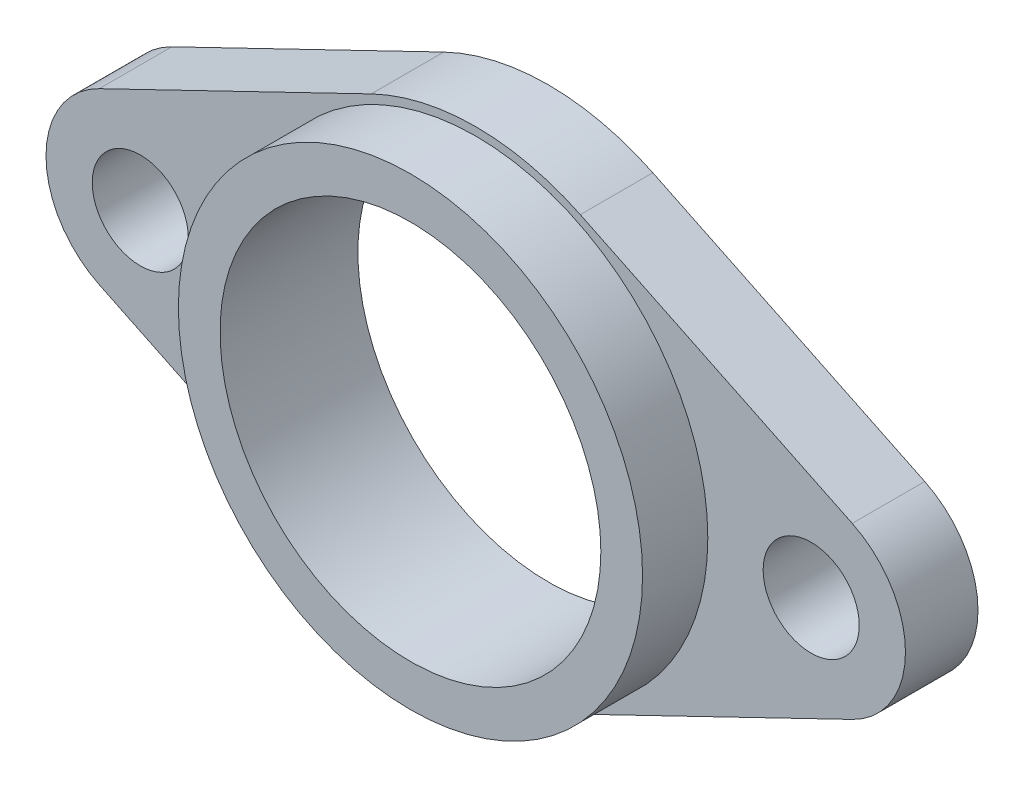
ISO-10303-21;
HEADER;
FILE_DESCRIPTION(('STEP AP214'),'2;1');
FILE_NAME('part.step','',(''),(''),'','','');
FILE_SCHEMA(('AUTOMOTIVE_DESIGN { 1 0 10303 214 1 1 1 1 }'));
ENDSEC;
DATA;
#1=APPLICATION_CONTEXT('core data for automotive mechanical design processes');
#2=APPLICATION_PROTOCOL_DEFINITION('international standard','automotive_design',2000,#1);
#3=PRODUCT_CONTEXT('',#1,'mechanical');
#4=PRODUCT('Part','Part','',(#3));
#5=PRODUCT_RELATED_PRODUCT_CATEGORY('part','',(#4));
#6=PRODUCT_DEFINITION_FORMATION('','',#4);
#7=PRODUCT_DEFINITION_CONTEXT('part definition',#1,'design');
#8=PRODUCT_DEFINITION('design','',#6,#7);
#9=PRODUCT_DEFINITION_SHAPE('','',#8);
#10=(LENGTH_UNIT() NAMED_UNIT(*) SI_UNIT(.MILLI.,.METRE.));
#11=(NAMED_UNIT(*) PLANE_ANGLE_UNIT() SI_UNIT($,.RADIAN.));
#12=(NAMED_UNIT(*) SI_UNIT($,.STERADIAN.) SOLID_ANGLE_UNIT());
#13=UNCERTAINTY_MEASURE_WITH_UNIT(LENGTH_MEASURE(1.E-05),#10,'distance_accuracy_value','');
#14=(GEOMETRIC_REPRESENTATION_CONTEXT(3) GLOBAL_UNCERTAINTY_ASSIGNED_CONTEXT((#13)) GLOBAL_UNIT_ASSIGNED_CONTEXT((#10,
#11,#12)) REPRESENTATION_CONTEXT('',''));
#15=CARTESIAN_POINT('',(0.,0.,0.));
#16=DIRECTION('',(0.,0.,1.));
#17=DIRECTION('',(1.,0.,0.));
#18=AXIS2_PLACEMENT_3D('',#15,#16,#17);
#19=CARTESIAN_POINT('',(-18.5,0.,0.));
#20=DIRECTION('',(0.,0.,1.));
#21=DIRECTION('',(1.,0.,0.));
#22=AXIS2_PLACEMENT_3D('',#19,#20,#21);
#23=PLANE('',#22);
#24=CARTESIAN_POINT('',(0.,0.,0.));
#25=DIRECTION('',(0.,0.,1.));
#26=DIRECTION('',(1.,0.,0.));
#27=AXIS2_PLACEMENT_3D('',#24,#25,#26);
#28=CIRCLE('',#27,10.5);
#29=CARTESIAN_POINT('',(10.5,0.,0.));
#30=VERTEX_POINT('',#29);
#31=EDGE_CURVE('E136',#30,#30,#28,.T.);
#32=ORIENTED_EDGE('',*,*,#31,.T.);
#33=EDGE_LOOP('',(#32));
#34=FACE_BOUND('',#33,.T.);
#35=CARTESIAN_POINT('',(-18.5,0.,0.));
#36=DIRECTION('',(0.,0.,1.));
#37=DIRECTION('',(1.,0.,0.));
#38=AXIS2_PLACEMENT_3D('',#35,#36,#37);
#39=CIRCLE('',#38,5.2);
#40=CARTESIAN_POINT('',(-20.7627027027027,4.68189881129248,0.));
#41=VERTEX_POINT('',#40);
#42=CARTESIAN_POINT('',(-20.7627027027027,-4.68189881129247,0.));
#43=VERTEX_POINT('',#42);
#44=EDGE_CURVE('E132',#41,#43,#39,.T.);
#45=ORIENTED_EDGE('',*,*,#44,.F.);
#46=DIRECTION('',(-0.900365156017784,-0.435135135135135,0.));
#47=VECTOR('',#46,1.);
#48=CARTESIAN_POINT('',(-20.7627027027027,4.68189881129248,0.));
#49=LINE('',#48,#47);
#50=CARTESIAN_POINT('',(-5.76554054054054,11.9298383172356,0.));
#51=VERTEX_POINT('',#50);
#52=EDGE_CURVE('E86',#51,#41,#49,.T.);
#53=ORIENTED_EDGE('',*,*,#52,.F.);
#54=CARTESIAN_POINT('',(0.,0.,0.));
#55=DIRECTION('',(0.,0.,1.));
#56=DIRECTION('',(1.,0.,0.));
#57=AXIS2_PLACEMENT_3D('',#54,#55,#56);
#58=CIRCLE('',#57,13.25);
#59=CARTESIAN_POINT('',(5.76554054054054,11.9298383172356,0.));
#60=VERTEX_POINT('',#59);
#61=EDGE_CURVE('E80',#60,#51,#58,.T.);
#62=ORIENTED_EDGE('',*,*,#61,.F.);
#63=DIRECTION('',(-0.900365156017784,0.435135135135135,0.));
#64=VECTOR('',#63,1.);
#65=CARTESIAN_POINT('',(5.76554054054054,11.9298383172356,0.));
#66=LINE('',#65,#64);
#67=CARTESIAN_POINT('',(20.7627027027027,4.68189881129248,0.));
#68=VERTEX_POINT('',#67);
#69=EDGE_CURVE('E122',#68,#60,#66,.T.);
#70=ORIENTED_EDGE('',*,*,#69,.F.);
#71=CARTESIAN_POINT('',(18.5,0.,0.));
#72=DIRECTION('',(0.,0.,1.));
#73=DIRECTION('',(1.,0.,0.));
#74=AXIS2_PLACEMENT_3D('',#71,#72,#73);
#75=CIRCLE('',#74,5.2);
#76=CARTESIAN_POINT('',(20.7627027027027,-4.68189881129248,0.));
#77=VERTEX_POINT('',#76);
#78=EDGE_CURVE('E142',#77,#68,#75,.T.);
#79=ORIENTED_EDGE('',*,*,#78,.F.);
#80=DIRECTION('',(0.900365156017784,0.435135135135135,0.));
#81=VECTOR('',#80,1.);
#82=CARTESIAN_POINT('',(20.7627027027027,-4.68189881129248,0.));
#83=LINE('',#82,#81);
#84=CARTESIAN_POINT('',(5.76554054054054,-11.9298383172356,0.));
#85=VERTEX_POINT('',#84);
#86=EDGE_CURVE('E140',#85,#77,#83,.T.);
#87=ORIENTED_EDGE('',*,*,#86,.F.);
#88=CARTESIAN_POINT('',(0.,0.,0.));
#89=DIRECTION('',(0.,0.,1.));
#90=DIRECTION('',(1.,0.,0.));
#91=AXIS2_PLACEMENT_3D('',#88,#89,#90);
#92=CIRCLE('',#91,13.25);
#93=CARTESIAN_POINT('',(-5.76554054054054,-11.9298383172356,0.));
#94=VERTEX_POINT('',#93);
#95=EDGE_CURVE('E138',#94,#85,#92,.T.);
#96=ORIENTED_EDGE('',*,*,#95,.F.);
#97=DIRECTION('',(0.900365156017784,-0.435135135135135,0.));
#98=VECTOR('',#97,1.);
#99=CARTESIAN_POINT('',(-20.7627027027027,-4.68189881129247,0.));
#100=LINE('',#99,#98);
#101=EDGE_CURVE('E135',#43,#94,#100,.T.);
#102=ORIENTED_EDGE('',*,*,#101,.F.);
#103=EDGE_LOOP('',(#45,#53,#62,#70,#79,#87,#96,#102));
#104=FACE_BOUND('',#103,.T.);
#105=CARTESIAN_POINT('',(18.5,0.,0.));
#106=DIRECTION('',(0.,0.,-1.));
#107=DIRECTION('',(-1.,0.,0.));
#108=AXIS2_PLACEMENT_3D('',#105,#106,#107);
#109=CIRCLE('',#108,2.65);
#110=CARTESIAN_POINT('',(15.85,0.,0.));
#111=VERTEX_POINT('',#110);
#112=EDGE_CURVE('E194',#111,#111,#109,.T.);
#113=ORIENTED_EDGE('',*,*,#112,.F.);
#114=EDGE_LOOP('',(#113));
#115=FACE_BOUND('',#114,.T.);
#116=CARTESIAN_POINT('',(-18.5,0.,0.));
#117=DIRECTION('',(0.,0.,-1.));
#118=DIRECTION('',(-1.,0.,0.));
#119=AXIS2_PLACEMENT_3D('',#116,#117,#118);
#120=CIRCLE('',#119,2.65);
#121=CARTESIAN_POINT('',(-21.15,0.,0.));
#122=VERTEX_POINT('',#121);
#123=EDGE_CURVE('E200',#122,#122,#120,.T.);
#124=ORIENTED_EDGE('',*,*,#123,.F.);
#125=EDGE_LOOP('',(#124));
#126=FACE_BOUND('',#125,.T.);
#127=ADVANCED_FACE('F34',(#34,#104,#115,#126),#23,.F.);
#128=CARTESIAN_POINT('',(-18.5,0.,4.));
#129=DIRECTION('',(0.,0.,1.));
#130=DIRECTION('',(1.,0.,0.));
#131=AXIS2_PLACEMENT_3D('',#128,#129,#130);
#132=PLANE('',#131);
#133=CARTESIAN_POINT('',(-18.5,0.,4.));
#134=DIRECTION('',(0.,0.,1.));
#135=DIRECTION('',(1.,0.,0.));
#136=AXIS2_PLACEMENT_3D('',#133,#134,#135);
#137=CIRCLE('',#136,2.65);
#138=CARTESIAN_POINT('',(-15.85,0.,4.));
#139=VERTEX_POINT('',#138);
#140=EDGE_CURVE('E197',#139,#139,#137,.T.);
#141=ORIENTED_EDGE('',*,*,#140,.F.);
#142=EDGE_LOOP('',(#141));
#143=FACE_BOUND('',#142,.T.);
#144=CARTESIAN_POINT('',(18.5,0.,4.));
#145=DIRECTION('',(0.,0.,1.));
#146=DIRECTION('',(1.,0.,0.));
#147=AXIS2_PLACEMENT_3D('',#144,#145,#146);
#148=CIRCLE('',#147,2.65);
#149=CARTESIAN_POINT('',(21.15,0.,4.));
#150=VERTEX_POINT('',#149);
#151=EDGE_CURVE('E191',#150,#150,#148,.T.);
#152=ORIENTED_EDGE('',*,*,#151,.F.);
#153=EDGE_LOOP('',(#152));
#154=FACE_BOUND('',#153,.T.);
#155=CARTESIAN_POINT('',(-18.5,0.,4.));
#156=DIRECTION('',(0.,0.,1.));
#157=DIRECTION('',(1.,0.,0.));
#158=AXIS2_PLACEMENT_3D('',#155,#156,#157);
#159=CIRCLE('',#158,5.2);
#160=CARTESIAN_POINT('',(-20.7627027027027,4.68189881129248,4.));
#161=VERTEX_POINT('',#160);
#162=CARTESIAN_POINT('',(-20.7627027027027,-4.68189881129247,4.));
#163=VERTEX_POINT('',#162);
#164=EDGE_CURVE('E147',#161,#163,#159,.T.);
#165=ORIENTED_EDGE('',*,*,#164,.T.);
#166=DIRECTION('',(0.900365156017784,-0.435135135135135,0.));
#167=VECTOR('',#166,1.);
#168=CARTESIAN_POINT('',(-20.7627027027027,-4.68189881129247,4.));
#169=LINE('',#168,#167);
#170=CARTESIAN_POINT('',(-5.76554054054054,-11.9298383172356,4.));
#171=VERTEX_POINT('',#170);
#172=EDGE_CURVE('E94',#163,#171,#169,.T.);
#173=ORIENTED_EDGE('',*,*,#172,.T.);
#174=CARTESIAN_POINT('',(0.,0.,4.));
#175=DIRECTION('',(0.,0.,1.));
#176=DIRECTION('',(1.,0.,0.));
#177=AXIS2_PLACEMENT_3D('',#174,#175,#176);
#178=CIRCLE('',#177,13.25);
#179=CARTESIAN_POINT('',(5.76554054054054,-11.9298383172356,4.));
#180=VERTEX_POINT('',#179);
#181=EDGE_CURVE('E162',#171,#180,#178,.T.);
#182=ORIENTED_EDGE('',*,*,#181,.T.);
#183=DIRECTION('',(0.900365156017784,0.435135135135135,0.));
#184=VECTOR('',#183,1.);
#185=CARTESIAN_POINT('',(20.7627027027027,-4.68189881129248,4.));
#186=LINE('',#185,#184);
#187=CARTESIAN_POINT('',(20.7627027027027,-4.68189881129248,4.));
#188=VERTEX_POINT('',#187);
#189=EDGE_CURVE('E174',#180,#188,#186,.T.);
#190=ORIENTED_EDGE('',*,*,#189,.T.);
#191=CARTESIAN_POINT('',(18.5,0.,4.));
#192=DIRECTION('',(0.,0.,1.));
#193=DIRECTION('',(1.,0.,0.));
#194=AXIS2_PLACEMENT_3D('',#191,#192,#193);
#195=CIRCLE('',#194,5.2);
#196=CARTESIAN_POINT('',(20.7627027027027,4.68189881129248,4.));
#197=VERTEX_POINT('',#196);
#198=EDGE_CURVE('E114',#188,#197,#195,.T.);
#199=ORIENTED_EDGE('',*,*,#198,.T.);
#200=DIRECTION('',(-0.900365156017784,0.435135135135135,0.));
#201=VECTOR('',#200,1.);
#202=CARTESIAN_POINT('',(5.76554054054054,11.9298383172356,4.));
#203=LINE('',#202,#201);
#204=CARTESIAN_POINT('',(5.76554054054054,11.9298383172356,4.));
#205=VERTEX_POINT('',#204);
#206=EDGE_CURVE('E107',#197,#205,#203,.T.);
#207=ORIENTED_EDGE('',*,*,#206,.T.);
#208=CARTESIAN_POINT('',(0.,0.,4.));
#209=DIRECTION('',(0.,0.,1.));
#210=DIRECTION('',(1.,0.,0.));
#211=AXIS2_PLACEMENT_3D('',#208,#209,#210);
#212=CIRCLE('',#211,13.25);
#213=CARTESIAN_POINT('',(-5.76554054054054,11.9298383172356,4.));
#214=VERTEX_POINT('',#213);
#215=EDGE_CURVE('E112',#205,#214,#212,.T.);
#216=ORIENTED_EDGE('',*,*,#215,.T.);
#217=DIRECTION('',(-0.900365156017784,-0.435135135135135,0.));
#218=VECTOR('',#217,1.);
#219=CARTESIAN_POINT('',(-20.7627027027027,4.68189881129248,4.));
#220=LINE('',#219,#218);
#221=EDGE_CURVE('E51',#214,#161,#220,.T.);
#222=ORIENTED_EDGE('',*,*,#221,.T.);
#223=EDGE_LOOP('',(#165,#173,#182,#190,#199,#207,#216,#222));
#224=FACE_BOUND('',#223,.T.);
#225=CARTESIAN_POINT('',(0.,0.,4.));
#226=DIRECTION('',(0.,0.,1.));
#227=DIRECTION('',(1.,0.,0.));
#228=AXIS2_PLACEMENT_3D('',#225,#226,#227);
#229=CIRCLE('',#228,12.8);
#230=CARTESIAN_POINT('',(-12.8,0.,4.));
#231=VERTEX_POINT('',#230);
#232=EDGE_CURVE('E182',#231,#231,#229,.F.);
#233=ORIENTED_EDGE('',*,*,#232,.T.);
#234=EDGE_LOOP('',(#233));
#235=FACE_BOUND('',#234,.T.);
#236=ADVANCED_FACE('F109',(#143,#154,#224,#235),#132,.T.);
#237=CARTESIAN_POINT('',(-18.5,0.,4.));
#238=DIRECTION('',(0.,0.,-1.));
#239=DIRECTION('',(-1.,0.,0.));
#240=AXIS2_PLACEMENT_3D('',#237,#238,#239);
#241=CYLINDRICAL_SURFACE('',#240,5.2);
#242=ORIENTED_EDGE('',*,*,#44,.T.);
#243=DIRECTION('',(0.,0.,-1.));
#244=VECTOR('',#243,1.);
#245=CARTESIAN_POINT('',(-20.7627027027027,-4.68189881129247,4.));
#246=LINE('',#245,#244);
#247=EDGE_CURVE('E11',#163,#43,#246,.T.);
#248=ORIENTED_EDGE('',*,*,#247,.F.);
#249=ORIENTED_EDGE('',*,*,#164,.F.);
#250=DIRECTION('',(0.,0.,-1.));
#251=VECTOR('',#250,1.);
#252=CARTESIAN_POINT('',(-20.7627027027027,4.68189881129248,4.));
#253=LINE('',#252,#251);
#254=EDGE_CURVE('E128',#161,#41,#253,.T.);
#255=ORIENTED_EDGE('',*,*,#254,.T.);
#256=EDGE_LOOP('',(#242,#248,#249,#255));
#257=FACE_BOUND('',#256,.T.);
#258=ADVANCED_FACE('F36',(#257),#241,.T.);
#259=CARTESIAN_POINT('',(-20.7627027027027,-4.68189881129247,4.));
#260=DIRECTION('',(0.435135135135135,0.900365156017784,0.));
#261=DIRECTION('',(-0.900365156017784,0.435135135135135,0.));
#262=AXIS2_PLACEMENT_3D('',#259,#260,#261);
#263=PLANE('',#262);
#264=ORIENTED_EDGE('',*,*,#101,.T.);
#265=DIRECTION('',(0.,0.,-1.));
#266=VECTOR('',#265,1.);
#267=CARTESIAN_POINT('',(-5.76554054054054,-11.9298383172356,4.));
#268=LINE('',#267,#266);
#269=EDGE_CURVE('E43',#171,#94,#268,.T.);
#270=ORIENTED_EDGE('',*,*,#269,.F.);
#271=ORIENTED_EDGE('',*,*,#172,.F.);
#272=ORIENTED_EDGE('',*,*,#247,.T.);
#273=EDGE_LOOP('',(#264,#270,#271,#272));
#274=FACE_BOUND('',#273,.T.);
#275=ADVANCED_FACE('F230',(#274),#263,.F.);
#276=CARTESIAN_POINT('',(0.,0.,4.));
#277=DIRECTION('',(0.,0.,-1.));
#278=DIRECTION('',(-1.,0.,0.));
#279=AXIS2_PLACEMENT_3D('',#276,#277,#278);
#280=CYLINDRICAL_SURFACE('',#279,13.25);
#281=ORIENTED_EDGE('',*,*,#95,.T.);
#282=DIRECTION('',(0.,0.,-1.));
#283=VECTOR('',#282,1.);
#284=CARTESIAN_POINT('',(5.76554054054054,-11.9298383172356,4.));
#285=LINE('',#284,#283);
#286=EDGE_CURVE('E154',#180,#85,#285,.T.);
#287=ORIENTED_EDGE('',*,*,#286,.F.);
#288=ORIENTED_EDGE('',*,*,#181,.F.);
#289=ORIENTED_EDGE('',*,*,#269,.T.);
#290=EDGE_LOOP('',(#281,#287,#288,#289));
#291=FACE_BOUND('',#290,.T.);
#292=ADVANCED_FACE('F160',(#291),#280,.T.);
#293=CARTESIAN_POINT('',(20.7627027027027,-4.68189881129248,4.));
#294=DIRECTION('',(-0.435135135135135,0.900365156017784,0.));
#295=DIRECTION('',(-0.900365156017784,-0.435135135135135,0.));
#296=AXIS2_PLACEMENT_3D('',#293,#294,#295);
#297=PLANE('',#296);
#298=ORIENTED_EDGE('',*,*,#86,.T.);
#299=DIRECTION('',(0.,0.,-1.));
#300=VECTOR('',#299,1.);
#301=CARTESIAN_POINT('',(20.7627027027027,-4.68189881129248,4.));
#302=LINE('',#301,#300);
#303=EDGE_CURVE('E151',#188,#77,#302,.T.);
#304=ORIENTED_EDGE('',*,*,#303,.F.);
#305=ORIENTED_EDGE('',*,*,#189,.F.);
#306=ORIENTED_EDGE('',*,*,#286,.T.);
#307=EDGE_LOOP('',(#298,#304,#305,#306));
#308=FACE_BOUND('',#307,.T.);
#309=ADVANCED_FACE('F170',(#308),#297,.F.);
#310=CARTESIAN_POINT('',(18.5,0.,4.));
#311=DIRECTION('',(0.,0.,-1.));
#312=DIRECTION('',(-1.,0.,0.));
#313=AXIS2_PLACEMENT_3D('',#310,#311,#312);
#314=CYLINDRICAL_SURFACE('',#313,5.2);
#315=ORIENTED_EDGE('',*,*,#78,.T.);
#316=DIRECTION('',(0.,0.,-1.));
#317=VECTOR('',#316,1.);
#318=CARTESIAN_POINT('',(20.7627027027027,4.68189881129248,4.));
#319=LINE('',#318,#317);
#320=EDGE_CURVE('E123',#197,#68,#319,.T.);
#321=ORIENTED_EDGE('',*,*,#320,.F.);
#322=ORIENTED_EDGE('',*,*,#198,.F.);
#323=ORIENTED_EDGE('',*,*,#303,.T.);
#324=EDGE_LOOP('',(#315,#321,#322,#323));
#325=FACE_BOUND('',#324,.T.);
#326=ADVANCED_FACE('F173',(#325),#314,.T.);
#327=CARTESIAN_POINT('',(5.76554054054054,11.9298383172356,4.));
#328=DIRECTION('',(-0.435135135135135,-0.900365156017784,0.));
#329=DIRECTION('',(0.900365156017784,-0.435135135135135,0.));
#330=AXIS2_PLACEMENT_3D('',#327,#328,#329);
#331=PLANE('',#330);
#332=ORIENTED_EDGE('',*,*,#69,.T.);
#333=DIRECTION('',(0.,0.,-1.));
#334=VECTOR('',#333,1.);
#335=CARTESIAN_POINT('',(5.76554054054054,11.9298383172356,4.));
#336=LINE('',#335,#334);
#337=EDGE_CURVE('E119',#205,#60,#336,.T.);
#338=ORIENTED_EDGE('',*,*,#337,.F.);
#339=ORIENTED_EDGE('',*,*,#206,.F.);
#340=ORIENTED_EDGE('',*,*,#320,.T.);
#341=EDGE_LOOP('',(#332,#338,#339,#340));
#342=FACE_BOUND('',#341,.T.);
#343=ADVANCED_FACE('F120',(#342),#331,.F.);
#344=CARTESIAN_POINT('',(0.,0.,4.));
#345=DIRECTION('',(0.,0.,-1.));
#346=DIRECTION('',(-1.,0.,0.));
#347=AXIS2_PLACEMENT_3D('',#344,#345,#346);
#348=CYLINDRICAL_SURFACE('',#347,13.25);
#349=ORIENTED_EDGE('',*,*,#61,.T.);
#350=DIRECTION('',(0.,0.,-1.));
#351=VECTOR('',#350,1.);
#352=CARTESIAN_POINT('',(-5.76554054054054,11.9298383172356,4.));
#353=LINE('',#352,#351);
#354=EDGE_CURVE('E124',#214,#51,#353,.T.);
#355=ORIENTED_EDGE('',*,*,#354,.F.);
#356=ORIENTED_EDGE('',*,*,#215,.F.);
#357=ORIENTED_EDGE('',*,*,#337,.T.);
#358=EDGE_LOOP('',(#349,#355,#356,#357));
#359=FACE_BOUND('',#358,.T.);
#360=ADVANCED_FACE('F126',(#359),#348,.T.);
#361=CARTESIAN_POINT('',(-20.7627027027027,4.68189881129248,4.));
#362=DIRECTION('',(0.435135135135135,-0.900365156017784,0.));
#363=DIRECTION('',(0.900365156017784,0.435135135135135,0.));
#364=AXIS2_PLACEMENT_3D('',#361,#362,#363);
#365=PLANE('',#364);
#366=ORIENTED_EDGE('',*,*,#52,.T.);
#367=ORIENTED_EDGE('',*,*,#254,.F.);
#368=ORIENTED_EDGE('',*,*,#221,.F.);
#369=ORIENTED_EDGE('',*,*,#354,.T.);
#370=EDGE_LOOP('',(#366,#367,#368,#369));
#371=FACE_BOUND('',#370,.T.);
#372=ADVANCED_FACE('F217',(#371),#365,.F.);
#373=CARTESIAN_POINT('',(0.,0.,4.));
#374=DIRECTION('',(0.,0.,-1.));
#375=DIRECTION('',(-1.,0.,0.));
#376=AXIS2_PLACEMENT_3D('',#373,#374,#375);
#377=CYLINDRICAL_SURFACE('',#376,10.5);
#378=ORIENTED_EDGE('',*,*,#31,.F.);
#379=EDGE_LOOP('',(#378));
#380=FACE_BOUND('',#379,.T.);
#381=CARTESIAN_POINT('',(0.,0.,7.6));
#382=DIRECTION('',(0.,0.,1.));
#383=DIRECTION('',(1.,0.,0.));
#384=AXIS2_PLACEMENT_3D('',#381,#382,#383);
#385=CIRCLE('',#384,10.5);
#386=CARTESIAN_POINT('',(10.5,0.,7.6));
#387=VERTEX_POINT('',#386);
#388=EDGE_CURVE('E188',#387,#387,#385,.T.);
#389=ORIENTED_EDGE('',*,*,#388,.T.);
#390=EDGE_LOOP('',(#389));
#391=FACE_BOUND('',#390,.T.);
#392=ADVANCED_FACE('F220',(#380,#391),#377,.F.);
#393=CARTESIAN_POINT('',(0.,0.,7.6));
#394=DIRECTION('',(0.,0.,1.));
#395=DIRECTION('',(1.,0.,0.));
#396=AXIS2_PLACEMENT_3D('',#393,#394,#395);
#397=PLANE('',#396);
#398=CARTESIAN_POINT('',(0.,0.,7.6));
#399=DIRECTION('',(0.,0.,1.));
#400=DIRECTION('',(1.,0.,0.));
#401=AXIS2_PLACEMENT_3D('',#398,#399,#400);
#402=CIRCLE('',#401,12.8);
#403=CARTESIAN_POINT('',(-12.8,0.,7.6));
#404=VERTEX_POINT('',#403);
#405=EDGE_CURVE('E185',#404,#404,#402,.T.);
#406=ORIENTED_EDGE('',*,*,#405,.T.);
#407=EDGE_LOOP('',(#406));
#408=FACE_BOUND('',#407,.T.);
#409=ORIENTED_EDGE('',*,*,#388,.F.);
#410=EDGE_LOOP('',(#409));
#411=FACE_BOUND('',#410,.T.);
#412=ADVANCED_FACE('F274',(#408,#411),#397,.T.);
#413=CARTESIAN_POINT('',(0.,0.,7.6));
#414=DIRECTION('',(0.,0.,-1.));
#415=DIRECTION('',(-1.,0.,0.));
#416=AXIS2_PLACEMENT_3D('',#413,#414,#415);
#417=CYLINDRICAL_SURFACE('',#416,12.8);
#418=CARTESIAN_POINT('',(-12.8,0.,4.));
#419=CARTESIAN_POINT('',(-12.8,0.,4.0375));
#420=CARTESIAN_POINT('',(-12.8,0.,4.075));
#421=CARTESIAN_POINT('',(-12.8,0.,4.15));
#422=CARTESIAN_POINT('',(-12.8,0.,4.1875));
#423=CARTESIAN_POINT('',(-12.8,0.,4.2625));
#424=CARTESIAN_POINT('',(-12.8,0.,4.3));
#425=CARTESIAN_POINT('',(-12.8,0.,4.375));
#426=CARTESIAN_POINT('',(-12.8,0.,4.4125));
#427=CARTESIAN_POINT('',(-12.8,0.,4.4875));
#428=CARTESIAN_POINT('',(-12.8,0.,4.525));
#429=CARTESIAN_POINT('',(-12.8,0.,4.6));
#430=CARTESIAN_POINT('',(-12.8,0.,4.6375));
#431=CARTESIAN_POINT('',(-12.8,0.,4.7125));
#432=CARTESIAN_POINT('',(-12.8,0.,4.75));
#433=CARTESIAN_POINT('',(-12.8,0.,4.825));
#434=CARTESIAN_POINT('',(-12.8,0.,4.8625));
#435=CARTESIAN_POINT('',(-12.8,0.,4.9375));
#436=CARTESIAN_POINT('',(-12.8,0.,4.975));
#437=CARTESIAN_POINT('',(-12.8,0.,5.05));
#438=CARTESIAN_POINT('',(-12.8,0.,5.0875));
#439=CARTESIAN_POINT('',(-12.8,0.,5.1625));
#440=CARTESIAN_POINT('',(-12.8,0.,5.2));
#441=CARTESIAN_POINT('',(-12.8,0.,5.275));
#442=CARTESIAN_POINT('',(-12.8,0.,5.3125));
#443=CARTESIAN_POINT('',(-12.8,0.,5.3875));
#444=CARTESIAN_POINT('',(-12.8,0.,5.425));
#445=CARTESIAN_POINT('',(-12.8,0.,5.5));
#446=CARTESIAN_POINT('',(-12.8,0.,5.5375));
#447=CARTESIAN_POINT('',(-12.8,0.,5.6125));
#448=CARTESIAN_POINT('',(-12.8,0.,5.65));
#449=CARTESIAN_POINT('',(-12.8,0.,5.725));
#450=CARTESIAN_POINT('',(-12.8,0.,5.7625));
#451=CARTESIAN_POINT('',(-12.8,0.,5.8375));
#452=CARTESIAN_POINT('',(-12.8,0.,5.875));
#453=CARTESIAN_POINT('',(-12.8,0.,5.95));
#454=CARTESIAN_POINT('',(-12.8,0.,5.9875));
#455=CARTESIAN_POINT('',(-12.8,0.,6.0625));
#456=CARTESIAN_POINT('',(-12.8,0.,6.1));
#457=CARTESIAN_POINT('',(-12.8,0.,6.175));
#458=CARTESIAN_POINT('',(-12.8,0.,6.2125));
#459=CARTESIAN_POINT('',(-12.8,0.,6.2875));
#460=CARTESIAN_POINT('',(-12.8,0.,6.325));
#461=CARTESIAN_POINT('',(-12.8,0.,6.4));
#462=CARTESIAN_POINT('',(-12.8,0.,6.4375));
#463=CARTESIAN_POINT('',(-12.8,0.,6.5125));
#464=CARTESIAN_POINT('',(-12.8,0.,6.55));
#465=CARTESIAN_POINT('',(-12.8,0.,6.625));
#466=CARTESIAN_POINT('',(-12.8,0.,6.6625));
#467=CARTESIAN_POINT('',(-12.8,0.,6.7375));
#468=CARTESIAN_POINT('',(-12.8,0.,6.775));
#469=CARTESIAN_POINT('',(-12.8,0.,6.85));
#470=CARTESIAN_POINT('',(-12.8,0.,6.8875));
#471=CARTESIAN_POINT('',(-12.8,0.,6.9625));
#472=CARTESIAN_POINT('',(-12.8,0.,7.));
#473=CARTESIAN_POINT('',(-12.8,0.,7.075));
#474=CARTESIAN_POINT('',(-12.8,0.,7.1125));
#475=CARTESIAN_POINT('',(-12.8,0.,7.1875));
#476=CARTESIAN_POINT('',(-12.8,0.,7.225));
#477=CARTESIAN_POINT('',(-12.8,0.,7.3));
#478=CARTESIAN_POINT('',(-12.8,0.,7.3375));
#479=CARTESIAN_POINT('',(-12.8,0.,7.4125));
#480=CARTESIAN_POINT('',(-12.8,0.,7.45));
#481=CARTESIAN_POINT('',(-12.8,0.,7.525));
#482=CARTESIAN_POINT('',(-12.8,0.,7.5625));
#483=CARTESIAN_POINT('',(-12.8,0.,7.6));
#484=B_SPLINE_CURVE_WITH_KNOTS('',3,(#418,#419,#420,#421,#422,#423,#424,#425,#426,#427,#428,
#429,#430,#431,#432,#433,#434,#435,#436,#437,#438,#439,#440,#441,#442,#443,#444,#445,#446,#447,
#448,#449,#450,#451,#452,#453,#454,#455,#456,#457,#458,#459,#460,#461,#462,#463,#464,#465,#466,
#467,#468,#469,#470,#471,#472,#473,#474,#475,#476,#477,#478,#479,#480,#481,#482,#483),
.UNSPECIFIED.,.F.,.F.,(4,2,2,2,2,2,2,2,2,2,2,2,2,2,2,2,2,2,2,2,2,2,2,2,2,2,2,2,2,2,2,2,4),(0.,
0.1125,0.225,0.337499999999999,0.449999999999999,0.5625,0.675,0.7875,0.9,1.0125,1.125,1.2375,
1.35,1.4625,1.575,1.6875,1.8,1.9125,2.025,2.1375,2.25,2.3625,2.475,2.5875,2.7,2.8125,2.925,
3.0375,3.15,3.2625,3.375,3.4875,3.6),.UNSPECIFIED.);
#485=EDGE_CURVE('BSEAM259',#231,#404,#484,.T.);
#486=ORIENTED_EDGE('',*,*,#232,.F.);
#487=ORIENTED_EDGE('',*,*,#405,.F.);
#488=ORIENTED_EDGE('',*,*,#485,.T.);
#489=ORIENTED_EDGE('',*,*,#485,.F.);
#490=EDGE_LOOP('',(#486,#488,#487,#489));
#491=FACE_BOUND('',#490,.T.);
#492=ADVANCED_FACE('F259',(#491),#417,.T.);
#493=CARTESIAN_POINT('',(18.5,0.,0.));
#494=DIRECTION('',(0.,0.,-1.));
#495=DIRECTION('',(-1.,0.,0.));
#496=AXIS2_PLACEMENT_3D('',#493,#494,#495);
#497=CYLINDRICAL_SURFACE('',#496,2.65);
#498=ORIENTED_EDGE('',*,*,#112,.T.);
#499=EDGE_LOOP('',(#498));
#500=FACE_BOUND('',#499,.T.);
#501=ORIENTED_EDGE('',*,*,#151,.T.);
#502=EDGE_LOOP('',(#501));
#503=FACE_BOUND('',#502,.T.);
#504=ADVANCED_FACE('F254',(#500,#503),#497,.F.);
#505=CARTESIAN_POINT('',(-18.5,0.,0.));
#506=DIRECTION('',(0.,0.,-1.));
#507=DIRECTION('',(-1.,0.,0.));
#508=AXIS2_PLACEMENT_3D('',#505,#506,#507);
#509=CYLINDRICAL_SURFACE('',#508,2.65);
#510=ORIENTED_EDGE('',*,*,#123,.T.);
#511=EDGE_LOOP('',(#510));
#512=FACE_BOUND('',#511,.T.);
#513=ORIENTED_EDGE('',*,*,#140,.T.);
#514=EDGE_LOOP('',(#513));
#515=FACE_BOUND('',#514,.T.);
#516=ADVANCED_FACE('F204',(#512,#515),#509,.F.);
#517=CLOSED_SHELL('',(#127,#236,#258,#275,#292,#309,#326,#343,#360,#372,#392,#412,#492,#504,#516));
#518=MANIFOLD_SOLID_BREP('B2',#517);
#519=ADVANCED_BREP_SHAPE_REPRESENTATION('',(#18,#518),#14);
#520=SHAPE_DEFINITION_REPRESENTATION(#9,#519);
ENDSEC;
END-ISO-10303-21;
